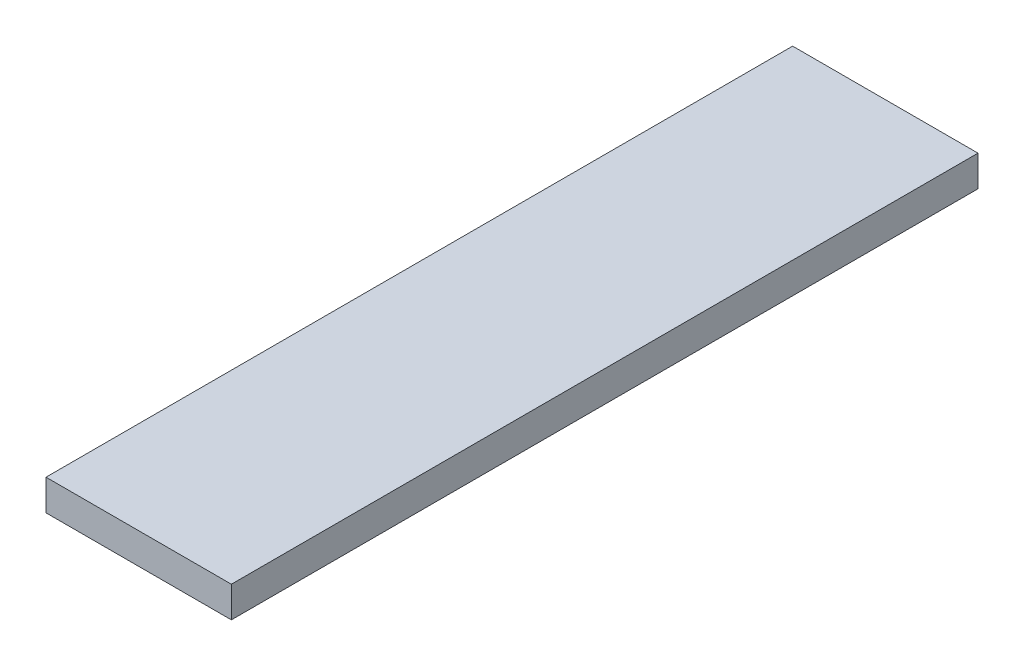
ISO-10303-21;
HEADER;
FILE_DESCRIPTION(('STEP AP214'),'2;1');
FILE_NAME('part.step','',(''),(''),'','','');
FILE_SCHEMA(('AUTOMOTIVE_DESIGN { 1 0 10303 214 1 1 1 1 }'));
ENDSEC;
DATA;
#1=APPLICATION_CONTEXT('core data for automotive mechanical design processes');
#2=APPLICATION_PROTOCOL_DEFINITION('international standard','automotive_design',2000,#1);
#3=PRODUCT_CONTEXT('',#1,'mechanical');
#4=PRODUCT('Part','Part','',(#3));
#5=PRODUCT_RELATED_PRODUCT_CATEGORY('part','',(#4));
#6=PRODUCT_DEFINITION_FORMATION('','',#4);
#7=PRODUCT_DEFINITION_CONTEXT('part definition',#1,'design');
#8=PRODUCT_DEFINITION('design','',#6,#7);
#9=PRODUCT_DEFINITION_SHAPE('','',#8);
#10=(LENGTH_UNIT() NAMED_UNIT(*) SI_UNIT(.MILLI.,.METRE.));
#11=(NAMED_UNIT(*) PLANE_ANGLE_UNIT() SI_UNIT($,.RADIAN.));
#12=(NAMED_UNIT(*) SI_UNIT($,.STERADIAN.) SOLID_ANGLE_UNIT());
#13=UNCERTAINTY_MEASURE_WITH_UNIT(LENGTH_MEASURE(1.E-05),#10,'distance_accuracy_value','');
#14=(GEOMETRIC_REPRESENTATION_CONTEXT(3) GLOBAL_UNCERTAINTY_ASSIGNED_CONTEXT((#13)) GLOBAL_UNIT_ASSIGNED_CONTEXT((#10,
#11,#12)) REPRESENTATION_CONTEXT('',''));
#15=CARTESIAN_POINT('',(0.,0.,0.));
#16=DIRECTION('',(0.,0.,1.));
#17=DIRECTION('',(1.,0.,0.));
#18=AXIS2_PLACEMENT_3D('',#15,#16,#17);
#19=CARTESIAN_POINT('',(-72.3457314106681,-1.8,54.));
#20=DIRECTION('',(1.,0.,0.));
#21=DIRECTION('',(0.,0.,-1.));
#22=AXIS2_PLACEMENT_3D('',#19,#20,#21);
#23=PLANE('',#22);
#24=DIRECTION('',(0.,0.,-1.));
#25=VECTOR('',#24,1.);
#26=CARTESIAN_POINT('',(-72.3457314106681,-4.2,54.));
#27=LINE('',#26,#25);
#28=CARTESIAN_POINT('',(-72.3457314106681,-4.2,54.));
#29=VERTEX_POINT('',#28);
#30=CARTESIAN_POINT('',(-72.3457314106681,-4.2,-4.));
#31=VERTEX_POINT('',#30);
#32=EDGE_CURVE('E43',#29,#31,#27,.T.);
#33=ORIENTED_EDGE('',*,*,#32,.T.);
#34=DIRECTION('',(0.,-1.,0.));
#35=VECTOR('',#34,1.);
#36=CARTESIAN_POINT('',(-72.3457314106681,-1.8,-4.));
#37=LINE('',#36,#35);
#38=CARTESIAN_POINT('',(-72.3457314106681,-1.8,-4.));
#39=VERTEX_POINT('',#38);
#40=EDGE_CURVE('E82',#39,#31,#37,.T.);
#41=ORIENTED_EDGE('',*,*,#40,.F.);
#42=DIRECTION('',(0.,0.,-1.));
#43=VECTOR('',#42,1.);
#44=CARTESIAN_POINT('',(-72.3457314106681,-1.8,54.));
#45=LINE('',#44,#43);
#46=CARTESIAN_POINT('',(-72.3457314106681,-1.8,54.));
#47=VERTEX_POINT('',#46);
#48=EDGE_CURVE('E11',#47,#39,#45,.T.);
#49=ORIENTED_EDGE('',*,*,#48,.F.);
#50=DIRECTION('',(0.,-1.,0.));
#51=VECTOR('',#50,1.);
#52=CARTESIAN_POINT('',(-72.3457314106681,-1.8,54.));
#53=LINE('',#52,#51);
#54=EDGE_CURVE('E56',#47,#29,#53,.T.);
#55=ORIENTED_EDGE('',*,*,#54,.T.);
#56=EDGE_LOOP('',(#33,#41,#49,#55));
#57=FACE_BOUND('',#56,.T.);
#58=ADVANCED_FACE('F39',(#57),#23,.T.);
#59=CARTESIAN_POINT('',(-86.745731410668,-1.8,54.));
#60=DIRECTION('',(0.,1.,0.));
#61=DIRECTION('',(-1.,0.,0.));
#62=AXIS2_PLACEMENT_3D('',#59,#60,#61);
#63=PLANE('',#62);
#64=ORIENTED_EDGE('',*,*,#48,.T.);
#65=DIRECTION('',(1.,0.,0.));
#66=VECTOR('',#65,1.);
#67=CARTESIAN_POINT('',(-72.3457314106681,-1.8,-4.));
#68=LINE('',#67,#66);
#69=CARTESIAN_POINT('',(-86.745731410668,-1.8,-4.));
#70=VERTEX_POINT('',#69);
#71=EDGE_CURVE('E96',#70,#39,#68,.T.);
#72=ORIENTED_EDGE('',*,*,#71,.F.);
#73=DIRECTION('',(0.,0.,-1.));
#74=VECTOR('',#73,1.);
#75=CARTESIAN_POINT('',(-86.745731410668,-1.8,54.));
#76=LINE('',#75,#74);
#77=CARTESIAN_POINT('',(-86.745731410668,-1.8,54.));
#78=VERTEX_POINT('',#77);
#79=EDGE_CURVE('E48',#78,#70,#76,.T.);
#80=ORIENTED_EDGE('',*,*,#79,.F.);
#81=DIRECTION('',(1.,0.,0.));
#82=VECTOR('',#81,1.);
#83=CARTESIAN_POINT('',(-86.745731410668,-1.8,54.));
#84=LINE('',#83,#82);
#85=EDGE_CURVE('E85',#78,#47,#84,.T.);
#86=ORIENTED_EDGE('',*,*,#85,.T.);
#87=EDGE_LOOP('',(#64,#72,#80,#86));
#88=FACE_BOUND('',#87,.T.);
#89=ADVANCED_FACE('F112',(#88),#63,.T.);
#90=CARTESIAN_POINT('',(-86.745731410668,-4.2,54.));
#91=DIRECTION('',(-1.,0.,0.));
#92=DIRECTION('',(0.,0.,1.));
#93=AXIS2_PLACEMENT_3D('',#90,#91,#92);
#94=PLANE('',#93);
#95=ORIENTED_EDGE('',*,*,#79,.T.);
#96=DIRECTION('',(0.,1.,0.));
#97=VECTOR('',#96,1.);
#98=CARTESIAN_POINT('',(-86.745731410668,-1.8,-4.));
#99=LINE('',#98,#97);
#100=CARTESIAN_POINT('',(-86.745731410668,-4.2,-4.));
#101=VERTEX_POINT('',#100);
#102=EDGE_CURVE('E91',#101,#70,#99,.T.);
#103=ORIENTED_EDGE('',*,*,#102,.F.);
#104=DIRECTION('',(0.,0.,-1.));
#105=VECTOR('',#104,1.);
#106=CARTESIAN_POINT('',(-86.745731410668,-4.2,54.));
#107=LINE('',#106,#105);
#108=CARTESIAN_POINT('',(-86.745731410668,-4.2,54.));
#109=VERTEX_POINT('',#108);
#110=EDGE_CURVE('E64',#109,#101,#107,.T.);
#111=ORIENTED_EDGE('',*,*,#110,.F.);
#112=DIRECTION('',(0.,1.,0.));
#113=VECTOR('',#112,1.);
#114=CARTESIAN_POINT('',(-86.745731410668,-4.2,54.));
#115=LINE('',#114,#113);
#116=EDGE_CURVE('E104',#109,#78,#115,.T.);
#117=ORIENTED_EDGE('',*,*,#116,.T.);
#118=EDGE_LOOP('',(#95,#103,#111,#117));
#119=FACE_BOUND('',#118,.T.);
#120=ADVANCED_FACE('F108',(#119),#94,.T.);
#121=CARTESIAN_POINT('',(-72.3457314106681,-4.2,54.));
#122=DIRECTION('',(0.,-1.,0.));
#123=DIRECTION('',(1.,0.,0.));
#124=AXIS2_PLACEMENT_3D('',#121,#122,#123);
#125=PLANE('',#124);
#126=ORIENTED_EDGE('',*,*,#110,.T.);
#127=DIRECTION('',(-1.,0.,0.));
#128=VECTOR('',#127,1.);
#129=CARTESIAN_POINT('',(-72.3457314106681,-4.2,-4.));
#130=LINE('',#129,#128);
#131=EDGE_CURVE('E87',#31,#101,#130,.T.);
#132=ORIENTED_EDGE('',*,*,#131,.F.);
#133=ORIENTED_EDGE('',*,*,#32,.F.);
#134=DIRECTION('',(-1.,0.,0.));
#135=VECTOR('',#134,1.);
#136=CARTESIAN_POINT('',(-72.3457314106681,-4.2,54.));
#137=LINE('',#136,#135);
#138=EDGE_CURVE('E102',#29,#109,#137,.T.);
#139=ORIENTED_EDGE('',*,*,#138,.T.);
#140=EDGE_LOOP('',(#126,#132,#133,#139));
#141=FACE_BOUND('',#140,.T.);
#142=ADVANCED_FACE('F88',(#141),#125,.T.);
#143=CARTESIAN_POINT('',(0.,0.,54.));
#144=DIRECTION('',(0.,0.,1.));
#145=DIRECTION('',(1.,0.,0.));
#146=AXIS2_PLACEMENT_3D('',#143,#144,#145);
#147=PLANE('',#146);
#148=ORIENTED_EDGE('',*,*,#138,.F.);
#149=ORIENTED_EDGE('',*,*,#54,.F.);
#150=ORIENTED_EDGE('',*,*,#85,.F.);
#151=ORIENTED_EDGE('',*,*,#116,.F.);
#152=EDGE_LOOP('',(#148,#149,#150,#151));
#153=FACE_BOUND('',#152,.T.);
#154=ADVANCED_FACE('F41',(#153),#147,.T.);
#155=CARTESIAN_POINT('',(0.,0.,-4.));
#156=DIRECTION('',(0.,0.,-1.));
#157=DIRECTION('',(-1.,0.,0.));
#158=AXIS2_PLACEMENT_3D('',#155,#156,#157);
#159=PLANE('',#158);
#160=ORIENTED_EDGE('',*,*,#40,.T.);
#161=ORIENTED_EDGE('',*,*,#131,.T.);
#162=ORIENTED_EDGE('',*,*,#102,.T.);
#163=ORIENTED_EDGE('',*,*,#71,.T.);
#164=EDGE_LOOP('',(#160,#161,#162,#163));
#165=FACE_BOUND('',#164,.T.);
#166=ADVANCED_FACE('F94',(#165),#159,.T.);
#167=CLOSED_SHELL('',(#58,#89,#120,#142,#154,#166));
#168=MANIFOLD_SOLID_BREP('B2',#167);
#169=ADVANCED_BREP_SHAPE_REPRESENTATION('',(#18,#168),#14);
#170=SHAPE_DEFINITION_REPRESENTATION(#9,#169);
ENDSEC;
END-ISO-10303-21;
